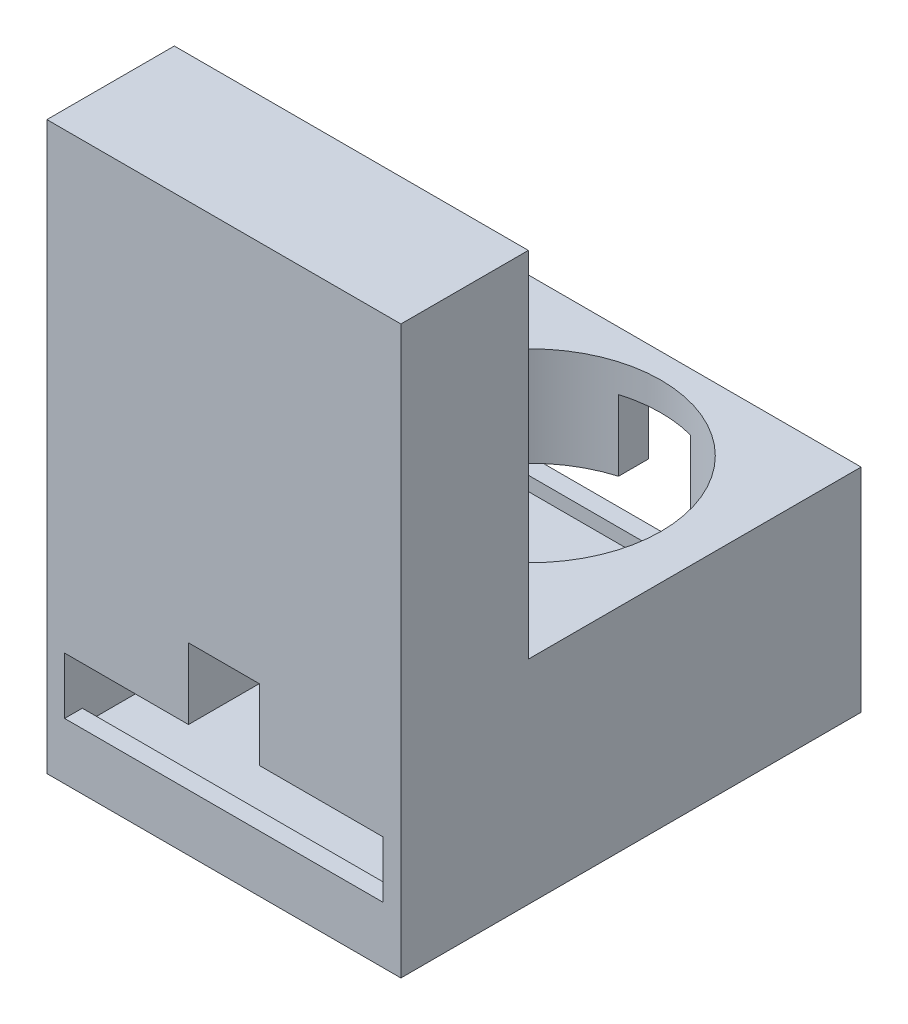
ISO-10303-21;
HEADER;
FILE_DESCRIPTION(('STEP AP214'),'2;1');
FILE_NAME('part.step','',(''),(''),'','','');
FILE_SCHEMA(('AUTOMOTIVE_DESIGN { 1 0 10303 214 1 1 1 1 }'));
ENDSEC;
DATA;
#1=APPLICATION_CONTEXT('core data for automotive mechanical design processes');
#2=APPLICATION_PROTOCOL_DEFINITION('international standard','automotive_design',2000,#1);
#3=PRODUCT_CONTEXT('',#1,'mechanical');
#4=PRODUCT('Part','Part','',(#3));
#5=PRODUCT_RELATED_PRODUCT_CATEGORY('part','',(#4));
#6=PRODUCT_DEFINITION_FORMATION('','',#4);
#7=PRODUCT_DEFINITION_CONTEXT('part definition',#1,'design');
#8=PRODUCT_DEFINITION('design','',#6,#7);
#9=PRODUCT_DEFINITION_SHAPE('','',#8);
#10=(LENGTH_UNIT() NAMED_UNIT(*) SI_UNIT(.MILLI.,.METRE.));
#11=(NAMED_UNIT(*) PLANE_ANGLE_UNIT() SI_UNIT($,.RADIAN.));
#12=(NAMED_UNIT(*) SI_UNIT($,.STERADIAN.) SOLID_ANGLE_UNIT());
#13=UNCERTAINTY_MEASURE_WITH_UNIT(LENGTH_MEASURE(1.E-05),#10,'distance_accuracy_value','');
#14=(GEOMETRIC_REPRESENTATION_CONTEXT(3) GLOBAL_UNCERTAINTY_ASSIGNED_CONTEXT((#13)) GLOBAL_UNIT_ASSIGNED_CONTEXT((#10,
#11,#12)) REPRESENTATION_CONTEXT('',''));
#15=CARTESIAN_POINT('',(0.,0.,0.));
#16=DIRECTION('',(0.,0.,1.));
#17=DIRECTION('',(1.,0.,0.));
#18=AXIS2_PLACEMENT_3D('',#15,#16,#17);
#19=CARTESIAN_POINT('',(0.,30.,0.));
#20=DIRECTION('',(0.,-1.,0.));
#21=DIRECTION('',(0.,0.,-1.));
#22=AXIS2_PLACEMENT_3D('',#19,#20,#21);
#23=PLANE('',#22);
#24=CARTESIAN_POINT('',(25.244510865418,30.,-43.));
#25=DIRECTION('',(0.,1.,0.));
#26=DIRECTION('',(0.,0.,1.));
#27=AXIS2_PLACEMENT_3D('',#24,#25,#26);
#28=CIRCLE('',#27,18.5);
#29=CARTESIAN_POINT('',(25.244510865418,30.,-24.5));
#30=VERTEX_POINT('',#29);
#31=EDGE_CURVE('E224',#30,#30,#28,.T.);
#32=ORIENTED_EDGE('',*,*,#31,.F.);
#33=EDGE_LOOP('',(#32));
#34=FACE_BOUND('',#33,.T.);
#35=DIRECTION('',(-1.,0.,0.));
#36=VECTOR('',#35,1.);
#37=CARTESIAN_POINT('',(0.,30.,-18.));
#38=LINE('',#37,#36);
#39=CARTESIAN_POINT('',(50.,30.,-18.));
#40=VERTEX_POINT('',#39);
#41=CARTESIAN_POINT('',(0.,30.,-18.));
#42=VERTEX_POINT('',#41);
#43=EDGE_CURVE('E59',#40,#42,#38,.T.);
#44=ORIENTED_EDGE('',*,*,#43,.F.);
#45=DIRECTION('',(0.,0.,-1.));
#46=VECTOR('',#45,1.);
#47=CARTESIAN_POINT('',(50.,30.,0.));
#48=LINE('',#47,#46);
#49=CARTESIAN_POINT('',(50.,30.,-65.));
#50=VERTEX_POINT('',#49);
#51=EDGE_CURVE('E340',#40,#50,#48,.T.);
#52=ORIENTED_EDGE('',*,*,#51,.T.);
#53=DIRECTION('',(-1.,0.,0.));
#54=VECTOR('',#53,1.);
#55=CARTESIAN_POINT('',(0.,30.,-65.));
#56=LINE('',#55,#54);
#57=CARTESIAN_POINT('',(0.,30.,-65.));
#58=VERTEX_POINT('',#57);
#59=EDGE_CURVE('E343',#50,#58,#56,.T.);
#60=ORIENTED_EDGE('',*,*,#59,.T.);
#61=DIRECTION('',(0.,0.,1.));
#62=VECTOR('',#61,1.);
#63=CARTESIAN_POINT('',(0.,30.,0.));
#64=LINE('',#63,#62);
#65=EDGE_CURVE('E338',#58,#42,#64,.T.);
#66=ORIENTED_EDGE('',*,*,#65,.T.);
#67=EDGE_LOOP('',(#44,#52,#60,#66));
#68=FACE_BOUND('',#67,.T.);
#69=ADVANCED_FACE('F44',(#34,#68),#23,.F.);
#70=CARTESIAN_POINT('',(20.,0.,-65.));
#71=DIRECTION('',(1.,0.,0.));
#72=DIRECTION('',(0.,0.,-1.));
#73=AXIS2_PLACEMENT_3D('',#70,#71,#72);
#74=PLANE('',#73);
#75=DIRECTION('',(0.,1.,0.));
#76=VECTOR('',#75,1.);
#77=CARTESIAN_POINT('',(20.,-36.3259018078045,-60.7410570649697));
#78=LINE('',#77,#76);
#79=CARTESIAN_POINT('',(20.,16.,-60.7410570649697));
#80=VERTEX_POINT('',#79);
#81=CARTESIAN_POINT('',(20.,26.,-60.7410570649697));
#82=VERTEX_POINT('',#81);
#83=EDGE_CURVE('E240',#80,#82,#78,.T.);
#84=ORIENTED_EDGE('',*,*,#83,.F.);
#85=DIRECTION('',(0.,0.,1.));
#86=VECTOR('',#85,1.);
#87=CARTESIAN_POINT('',(20.,16.,-65.));
#88=LINE('',#87,#86);
#89=CARTESIAN_POINT('',(20.,16.,-65.));
#90=VERTEX_POINT('',#89);
#91=EDGE_CURVE('E335',#90,#80,#88,.T.);
#92=ORIENTED_EDGE('',*,*,#91,.F.);
#93=DIRECTION('',(0.,1.,0.));
#94=VECTOR('',#93,1.);
#95=CARTESIAN_POINT('',(20.,0.,-65.));
#96=LINE('',#95,#94);
#97=CARTESIAN_POINT('',(20.,26.,-65.));
#98=VERTEX_POINT('',#97);
#99=EDGE_CURVE('E270',#90,#98,#96,.T.);
#100=ORIENTED_EDGE('',*,*,#99,.T.);
#101=DIRECTION('',(0.,0.,1.));
#102=VECTOR('',#101,1.);
#103=CARTESIAN_POINT('',(20.,26.,-65.));
#104=LINE('',#103,#102);
#105=EDGE_CURVE('E311',#98,#82,#104,.T.);
#106=ORIENTED_EDGE('',*,*,#105,.T.);
#107=EDGE_LOOP('',(#84,#92,#100,#106));
#108=FACE_BOUND('',#107,.T.);
#109=ADVANCED_FACE('F382',(#108),#74,.T.);
#110=CARTESIAN_POINT('',(0.,26.,-65.));
#111=DIRECTION('',(0.,-1.,0.));
#112=DIRECTION('',(1.,0.,0.));
#113=AXIS2_PLACEMENT_3D('',#110,#111,#112);
#114=PLANE('',#113);
#115=CARTESIAN_POINT('',(25.244510865418,26.,-43.));
#116=DIRECTION('',(0.,-1.,0.));
#117=DIRECTION('',(1.,0.,0.));
#118=AXIS2_PLACEMENT_3D('',#115,#116,#117);
#119=CIRCLE('',#118,18.5);
#120=CARTESIAN_POINT('',(30.,26.,-25.1216521151737));
#121=VERTEX_POINT('',#120);
#122=CARTESIAN_POINT('',(20.,26.,-25.2589429350303));
#123=VERTEX_POINT('',#122);
#124=EDGE_CURVE('E233',#121,#123,#119,.T.);
#125=ORIENTED_EDGE('',*,*,#124,.F.);
#126=DIRECTION('',(0.,0.,1.));
#127=VECTOR('',#126,1.);
#128=CARTESIAN_POINT('',(30.,26.,-65.));
#129=LINE('',#128,#127);
#130=CARTESIAN_POINT('',(30.,26.,0.));
#131=VERTEX_POINT('',#130);
#132=EDGE_CURVE('E318',#121,#131,#129,.T.);
#133=ORIENTED_EDGE('',*,*,#132,.T.);
#134=DIRECTION('',(1.,0.,0.));
#135=VECTOR('',#134,1.);
#136=CARTESIAN_POINT('',(0.,26.,0.));
#137=LINE('',#136,#135);
#138=CARTESIAN_POINT('',(20.,26.,0.));
#139=VERTEX_POINT('',#138);
#140=EDGE_CURVE('E273',#139,#131,#137,.T.);
#141=ORIENTED_EDGE('',*,*,#140,.F.);
#142=EDGE_CURVE('E314',#123,#139,#104,.T.);
#143=ORIENTED_EDGE('',*,*,#142,.F.);
#144=EDGE_LOOP('',(#125,#133,#141,#143));
#145=FACE_BOUND('',#144,.T.);
#146=ADVANCED_FACE('F388',(#145),#114,.T.);
#147=CARTESIAN_POINT('',(30.,0.,-65.));
#148=DIRECTION('',(1.,0.,0.));
#149=DIRECTION('',(0.,1.,0.));
#150=AXIS2_PLACEMENT_3D('',#147,#148,#149);
#151=PLANE('',#150);
#152=DIRECTION('',(0.,0.,1.));
#153=VECTOR('',#152,1.);
#154=CARTESIAN_POINT('',(30.,16.,-65.));
#155=LINE('',#154,#153);
#156=CARTESIAN_POINT('',(30.,16.,-65.));
#157=VERTEX_POINT('',#156);
#158=CARTESIAN_POINT('',(30.,16.,-60.8783478848263));
#159=VERTEX_POINT('',#158);
#160=EDGE_CURVE('E319',#157,#159,#155,.T.);
#161=ORIENTED_EDGE('',*,*,#160,.T.);
#162=DIRECTION('',(0.,1.,0.));
#163=VECTOR('',#162,1.);
#164=CARTESIAN_POINT('',(30.,-36.3259018078045,-60.8783478848263));
#165=LINE('',#164,#163);
#166=CARTESIAN_POINT('',(30.,26.,-60.8783478848263));
#167=VERTEX_POINT('',#166);
#168=EDGE_CURVE('E237',#159,#167,#165,.T.);
#169=ORIENTED_EDGE('',*,*,#168,.T.);
#170=CARTESIAN_POINT('',(30.,26.,-65.));
#171=VERTEX_POINT('',#170);
#172=EDGE_CURVE('E315',#171,#167,#129,.T.);
#173=ORIENTED_EDGE('',*,*,#172,.F.);
#174=DIRECTION('',(0.,1.,0.));
#175=VECTOR('',#174,1.);
#176=CARTESIAN_POINT('',(30.,0.,-65.));
#177=LINE('',#176,#175);
#178=EDGE_CURVE('E285',#157,#171,#177,.T.);
#179=ORIENTED_EDGE('',*,*,#178,.F.);
#180=EDGE_LOOP('',(#161,#169,#173,#179));
#181=FACE_BOUND('',#180,.T.);
#182=ADVANCED_FACE('F411',(#181),#151,.F.);
#183=CARTESIAN_POINT('',(0.,8.,-65.));
#184=DIRECTION('',(0.,-1.,0.));
#185=DIRECTION('',(0.,0.,-1.));
#186=AXIS2_PLACEMENT_3D('',#183,#184,#185);
#187=PLANE('',#186);
#188=DIRECTION('',(1.,0.,0.));
#189=VECTOR('',#188,1.);
#190=CARTESIAN_POINT('',(-57.5333240792145,8.,-2.5));
#191=LINE('',#190,#189);
#192=CARTESIAN_POINT('',(2.5,8.,-2.5));
#193=VERTEX_POINT('',#192);
#194=CARTESIAN_POINT('',(47.5,8.,-2.5));
#195=VERTEX_POINT('',#194);
#196=EDGE_CURVE('E265',#193,#195,#191,.T.);
#197=ORIENTED_EDGE('',*,*,#196,.F.);
#198=DIRECTION('',(0.,0.,1.));
#199=VECTOR('',#198,1.);
#200=CARTESIAN_POINT('',(2.5,8.,-65.));
#201=LINE('',#200,#199);
#202=CARTESIAN_POINT('',(2.5,8.,0.));
#203=VERTEX_POINT('',#202);
#204=EDGE_CURVE('E332',#193,#203,#201,.T.);
#205=ORIENTED_EDGE('',*,*,#204,.T.);
#206=DIRECTION('',(1.,0.,0.));
#207=VECTOR('',#206,1.);
#208=CARTESIAN_POINT('',(0.,8.,0.));
#209=LINE('',#208,#207);
#210=CARTESIAN_POINT('',(47.5,8.,0.));
#211=VERTEX_POINT('',#210);
#212=EDGE_CURVE('E300',#203,#211,#209,.T.);
#213=ORIENTED_EDGE('',*,*,#212,.T.);
#214=DIRECTION('',(0.,0.,1.));
#215=VECTOR('',#214,1.);
#216=CARTESIAN_POINT('',(47.5,8.,-65.));
#217=LINE('',#216,#215);
#218=EDGE_CURVE('E328',#195,#211,#217,.T.);
#219=ORIENTED_EDGE('',*,*,#218,.F.);
#220=EDGE_LOOP('',(#197,#205,#213,#219));
#221=FACE_BOUND('',#220,.T.);
#222=ADVANCED_FACE('F405',(#221),#187,.F.);
#223=DIRECTION('',(1.,0.,0.));
#224=VECTOR('',#223,1.);
#225=CARTESIAN_POINT('',(-57.5333240792145,7.99999999999999,-62.5));
#226=LINE('',#225,#224);
#227=CARTESIAN_POINT('',(2.5,8.,-62.5));
#228=VERTEX_POINT('',#227);
#229=CARTESIAN_POINT('',(47.5,7.99999999999999,-62.5));
#230=VERTEX_POINT('',#229);
#231=EDGE_CURVE('E262',#228,#230,#226,.T.);
#232=ORIENTED_EDGE('',*,*,#231,.T.);
#233=CARTESIAN_POINT('',(47.5,8.,-65.));
#234=VERTEX_POINT('',#233);
#235=EDGE_CURVE('E325',#234,#230,#217,.T.);
#236=ORIENTED_EDGE('',*,*,#235,.F.);
#237=DIRECTION('',(1.,0.,0.));
#238=VECTOR('',#237,1.);
#239=CARTESIAN_POINT('',(0.,8.,-65.));
#240=LINE('',#239,#238);
#241=CARTESIAN_POINT('',(2.5,8.,-65.));
#242=VERTEX_POINT('',#241);
#243=EDGE_CURVE('E279',#242,#234,#240,.T.);
#244=ORIENTED_EDGE('',*,*,#243,.F.);
#245=EDGE_CURVE('E329',#242,#228,#201,.T.);
#246=ORIENTED_EDGE('',*,*,#245,.T.);
#247=EDGE_LOOP('',(#232,#236,#244,#246));
#248=FACE_BOUND('',#247,.T.);
#249=ADVANCED_FACE('F401',(#248),#187,.F.);
#250=CARTESIAN_POINT('',(0.,30.,0.));
#251=DIRECTION('',(0.,0.,-1.));
#252=DIRECTION('',(-1.,0.,0.));
#253=AXIS2_PLACEMENT_3D('',#250,#251,#252);
#254=PLANE('',#253);
#255=DIRECTION('',(1.,0.,0.));
#256=VECTOR('',#255,1.);
#257=CARTESIAN_POINT('',(0.,0.,0.));
#258=LINE('',#257,#256);
#259=CARTESIAN_POINT('',(0.,0.,0.));
#260=VERTEX_POINT('',#259);
#261=CARTESIAN_POINT('',(50.,0.,0.));
#262=VERTEX_POINT('',#261);
#263=EDGE_CURVE('E347',#260,#262,#258,.T.);
#264=ORIENTED_EDGE('',*,*,#263,.T.);
#265=DIRECTION('',(0.,-1.,0.));
#266=VECTOR('',#265,1.);
#267=CARTESIAN_POINT('',(50.,30.,0.));
#268=LINE('',#267,#266);
#269=CARTESIAN_POINT('',(50.,80.,0.));
#270=VERTEX_POINT('',#269);
#271=EDGE_CURVE('E52',#270,#262,#268,.T.);
#272=ORIENTED_EDGE('',*,*,#271,.F.);
#273=DIRECTION('',(1.,0.,0.));
#274=VECTOR('',#273,1.);
#275=CARTESIAN_POINT('',(0.,80.,0.));
#276=LINE('',#275,#274);
#277=CARTESIAN_POINT('',(0.,80.,0.));
#278=VERTEX_POINT('',#277);
#279=EDGE_CURVE('E202',#278,#270,#276,.T.);
#280=ORIENTED_EDGE('',*,*,#279,.F.);
#281=DIRECTION('',(0.,-1.,0.));
#282=VECTOR('',#281,1.);
#283=CARTESIAN_POINT('',(0.,30.,0.));
#284=LINE('',#283,#282);
#285=EDGE_CURVE('E11',#278,#260,#284,.T.);
#286=ORIENTED_EDGE('',*,*,#285,.T.);
#287=EDGE_LOOP('',(#264,#272,#280,#286));
#288=FACE_BOUND('',#287,.T.);
#289=DIRECTION('',(0.,1.,0.));
#290=VECTOR('',#289,1.);
#291=CARTESIAN_POINT('',(20.,0.,0.));
#292=LINE('',#291,#290);
#293=CARTESIAN_POINT('',(20.,16.,0.));
#294=VERTEX_POINT('',#293);
#295=EDGE_CURVE('E253',#294,#139,#292,.T.);
#296=ORIENTED_EDGE('',*,*,#295,.T.);
#297=ORIENTED_EDGE('',*,*,#140,.T.);
#298=DIRECTION('',(0.,1.,0.));
#299=VECTOR('',#298,1.);
#300=CARTESIAN_POINT('',(30.,0.,0.));
#301=LINE('',#300,#299);
#302=CARTESIAN_POINT('',(30.,16.,0.));
#303=VERTEX_POINT('',#302);
#304=EDGE_CURVE('E306',#303,#131,#301,.T.);
#305=ORIENTED_EDGE('',*,*,#304,.F.);
#306=DIRECTION('',(1.,0.,0.));
#307=VECTOR('',#306,1.);
#308=CARTESIAN_POINT('',(0.,16.,0.));
#309=LINE('',#308,#307);
#310=CARTESIAN_POINT('',(47.5,16.,0.));
#311=VERTEX_POINT('',#310);
#312=EDGE_CURVE('E297',#303,#311,#309,.T.);
#313=ORIENTED_EDGE('',*,*,#312,.T.);
#314=DIRECTION('',(0.,1.,0.));
#315=VECTOR('',#314,1.);
#316=CARTESIAN_POINT('',(47.5,0.,0.));
#317=LINE('',#316,#315);
#318=EDGE_CURVE('E303',#211,#311,#317,.T.);
#319=ORIENTED_EDGE('',*,*,#318,.F.);
#320=ORIENTED_EDGE('',*,*,#212,.F.);
#321=DIRECTION('',(0.,1.,0.));
#322=VECTOR('',#321,1.);
#323=CARTESIAN_POINT('',(2.5,0.,0.));
#324=LINE('',#323,#322);
#325=CARTESIAN_POINT('',(2.5,16.,0.));
#326=VERTEX_POINT('',#325);
#327=EDGE_CURVE('E296',#203,#326,#324,.T.);
#328=ORIENTED_EDGE('',*,*,#327,.T.);
#329=EDGE_CURVE('E293',#326,#294,#309,.T.);
#330=ORIENTED_EDGE('',*,*,#329,.T.);
#331=EDGE_LOOP('',(#296,#297,#305,#313,#319,#320,#328,#330));
#332=FACE_BOUND('',#331,.T.);
#333=ADVANCED_FACE('F203',(#288,#332),#254,.F.);
#334=CARTESIAN_POINT('',(0.,30.,-65.));
#335=DIRECTION('',(0.,0.,1.));
#336=DIRECTION('',(1.,0.,0.));
#337=AXIS2_PLACEMENT_3D('',#334,#335,#336);
#338=PLANE('',#337);
#339=DIRECTION('',(-1.,0.,0.));
#340=VECTOR('',#339,1.);
#341=CARTESIAN_POINT('',(0.,0.,-65.));
#342=LINE('',#341,#340);
#343=CARTESIAN_POINT('',(50.,0.,-65.));
#344=VERTEX_POINT('',#343);
#345=CARTESIAN_POINT('',(0.,0.,-65.));
#346=VERTEX_POINT('',#345);
#347=EDGE_CURVE('E341',#344,#346,#342,.T.);
#348=ORIENTED_EDGE('',*,*,#347,.T.);
#349=DIRECTION('',(0.,-1.,0.));
#350=VECTOR('',#349,1.);
#351=CARTESIAN_POINT('',(0.,30.,-65.));
#352=LINE('',#351,#350);
#353=EDGE_CURVE('E345',#58,#346,#352,.T.);
#354=ORIENTED_EDGE('',*,*,#353,.F.);
#355=ORIENTED_EDGE('',*,*,#59,.F.);
#356=DIRECTION('',(0.,-1.,0.));
#357=VECTOR('',#356,1.);
#358=CARTESIAN_POINT('',(50.,30.,-65.));
#359=LINE('',#358,#357);
#360=EDGE_CURVE('E353',#50,#344,#359,.T.);
#361=ORIENTED_EDGE('',*,*,#360,.T.);
#362=EDGE_LOOP('',(#348,#354,#355,#361));
#363=FACE_BOUND('',#362,.T.);
#364=ORIENTED_EDGE('',*,*,#99,.F.);
#365=DIRECTION('',(1.,0.,0.));
#366=VECTOR('',#365,1.);
#367=CARTESIAN_POINT('',(0.,16.,-65.));
#368=LINE('',#367,#366);
#369=CARTESIAN_POINT('',(2.5,16.,-65.));
#370=VERTEX_POINT('',#369);
#371=EDGE_CURVE('E272',#370,#90,#368,.T.);
#372=ORIENTED_EDGE('',*,*,#371,.F.);
#373=DIRECTION('',(0.,1.,0.));
#374=VECTOR('',#373,1.);
#375=CARTESIAN_POINT('',(2.5,0.,-65.));
#376=LINE('',#375,#374);
#377=EDGE_CURVE('E275',#242,#370,#376,.T.);
#378=ORIENTED_EDGE('',*,*,#377,.F.);
#379=ORIENTED_EDGE('',*,*,#243,.T.);
#380=DIRECTION('',(0.,1.,0.));
#381=VECTOR('',#380,1.);
#382=CARTESIAN_POINT('',(47.5,0.,-65.));
#383=LINE('',#382,#381);
#384=CARTESIAN_POINT('',(47.5,16.,-65.));
#385=VERTEX_POINT('',#384);
#386=EDGE_CURVE('E282',#234,#385,#383,.T.);
#387=ORIENTED_EDGE('',*,*,#386,.T.);
#388=EDGE_CURVE('E276',#157,#385,#368,.T.);
#389=ORIENTED_EDGE('',*,*,#388,.F.);
#390=ORIENTED_EDGE('',*,*,#178,.T.);
#391=DIRECTION('',(1.,0.,0.));
#392=VECTOR('',#391,1.);
#393=CARTESIAN_POINT('',(0.,26.,-65.));
#394=LINE('',#393,#392);
#395=EDGE_CURVE('E288',#98,#171,#394,.T.);
#396=ORIENTED_EDGE('',*,*,#395,.F.);
#397=EDGE_LOOP('',(#364,#372,#378,#379,#387,#389,#390,#396));
#398=FACE_BOUND('',#397,.T.);
#399=ADVANCED_FACE('F365',(#363,#398),#338,.F.);
#400=CARTESIAN_POINT('',(0.,30.,0.));
#401=DIRECTION('',(1.,0.,0.));
#402=DIRECTION('',(0.,0.,-1.));
#403=AXIS2_PLACEMENT_3D('',#400,#401,#402);
#404=PLANE('',#403);
#405=DIRECTION('',(0.,0.,1.));
#406=VECTOR('',#405,1.);
#407=CARTESIAN_POINT('',(0.,0.,0.));
#408=LINE('',#407,#406);
#409=EDGE_CURVE('E199',#346,#260,#408,.T.);
#410=ORIENTED_EDGE('',*,*,#409,.T.);
#411=ORIENTED_EDGE('',*,*,#285,.F.);
#412=DIRECTION('',(0.,0.,1.));
#413=VECTOR('',#412,1.);
#414=CARTESIAN_POINT('',(0.,80.,0.));
#415=LINE('',#414,#413);
#416=CARTESIAN_POINT('',(0.,80.,-18.));
#417=VERTEX_POINT('',#416);
#418=EDGE_CURVE('E196',#417,#278,#415,.T.);
#419=ORIENTED_EDGE('',*,*,#418,.F.);
#420=DIRECTION('',(0.,-1.,0.));
#421=VECTOR('',#420,1.);
#422=CARTESIAN_POINT('',(0.,80.,-18.));
#423=LINE('',#422,#421);
#424=EDGE_CURVE('E218',#417,#42,#423,.T.);
#425=ORIENTED_EDGE('',*,*,#424,.T.);
#426=ORIENTED_EDGE('',*,*,#65,.F.);
#427=ORIENTED_EDGE('',*,*,#353,.T.);
#428=EDGE_LOOP('',(#410,#411,#419,#425,#426,#427));
#429=FACE_BOUND('',#428,.T.);
#430=ADVANCED_FACE('F46',(#429),#404,.F.);
#431=CARTESIAN_POINT('',(50.,30.,0.));
#432=DIRECTION('',(-1.,0.,0.));
#433=DIRECTION('',(0.,0.,1.));
#434=AXIS2_PLACEMENT_3D('',#431,#432,#433);
#435=PLANE('',#434);
#436=DIRECTION('',(0.,0.,-1.));
#437=VECTOR('',#436,1.);
#438=CARTESIAN_POINT('',(50.,0.,0.));
#439=LINE('',#438,#437);
#440=EDGE_CURVE('E349',#262,#344,#439,.T.);
#441=ORIENTED_EDGE('',*,*,#440,.T.);
#442=ORIENTED_EDGE('',*,*,#360,.F.);
#443=ORIENTED_EDGE('',*,*,#51,.F.);
#444=DIRECTION('',(0.,-1.,0.));
#445=VECTOR('',#444,1.);
#446=CARTESIAN_POINT('',(50.,80.,-18.));
#447=LINE('',#446,#445);
#448=CARTESIAN_POINT('',(50.,80.,-18.));
#449=VERTEX_POINT('',#448);
#450=EDGE_CURVE('E221',#449,#40,#447,.T.);
#451=ORIENTED_EDGE('',*,*,#450,.F.);
#452=DIRECTION('',(0.,0.,-1.));
#453=VECTOR('',#452,1.);
#454=CARTESIAN_POINT('',(50.,80.,0.));
#455=LINE('',#454,#453);
#456=EDGE_CURVE('E208',#270,#449,#455,.T.);
#457=ORIENTED_EDGE('',*,*,#456,.F.);
#458=ORIENTED_EDGE('',*,*,#271,.T.);
#459=EDGE_LOOP('',(#441,#442,#443,#451,#457,#458));
#460=FACE_BOUND('',#459,.T.);
#461=ADVANCED_FACE('F357',(#460),#435,.F.);
#462=CARTESIAN_POINT('',(0.,0.,0.));
#463=DIRECTION('',(0.,-1.,0.));
#464=DIRECTION('',(0.,0.,-1.));
#465=AXIS2_PLACEMENT_3D('',#462,#463,#464);
#466=PLANE('',#465);
#467=ORIENTED_EDGE('',*,*,#409,.F.);
#468=ORIENTED_EDGE('',*,*,#347,.F.);
#469=ORIENTED_EDGE('',*,*,#440,.F.);
#470=ORIENTED_EDGE('',*,*,#263,.F.);
#471=EDGE_LOOP('',(#467,#468,#469,#470));
#472=FACE_BOUND('',#471,.T.);
#473=ADVANCED_FACE('F362',(#472),#466,.T.);
#474=DIRECTION('',(0.,1.,0.));
#475=VECTOR('',#474,1.);
#476=CARTESIAN_POINT('',(20.,-36.3259018078045,-25.2589429350303));
#477=LINE('',#476,#475);
#478=CARTESIAN_POINT('',(20.,16.,-25.2589429350303));
#479=VERTEX_POINT('',#478);
#480=EDGE_CURVE('E67',#123,#479,#477,.F.);
#481=ORIENTED_EDGE('',*,*,#480,.F.);
#482=ORIENTED_EDGE('',*,*,#142,.T.);
#483=ORIENTED_EDGE('',*,*,#295,.F.);
#484=EDGE_CURVE('E290',#479,#294,#88,.T.);
#485=ORIENTED_EDGE('',*,*,#484,.F.);
#486=EDGE_LOOP('',(#481,#482,#483,#485));
#487=FACE_BOUND('',#486,.T.);
#488=ADVANCED_FACE('F391',(#487),#74,.T.);
#489=EDGE_CURVE('E235',#82,#167,#119,.T.);
#490=ORIENTED_EDGE('',*,*,#489,.F.);
#491=ORIENTED_EDGE('',*,*,#105,.F.);
#492=ORIENTED_EDGE('',*,*,#395,.T.);
#493=ORIENTED_EDGE('',*,*,#172,.T.);
#494=EDGE_LOOP('',(#490,#491,#492,#493));
#495=FACE_BOUND('',#494,.T.);
#496=ADVANCED_FACE('F456',(#495),#114,.T.);
#497=ORIENTED_EDGE('',*,*,#132,.F.);
#498=DIRECTION('',(0.,1.,0.));
#499=VECTOR('',#498,1.);
#500=CARTESIAN_POINT('',(30.,-36.3259018078045,-25.1216521151737));
#501=LINE('',#500,#499);
#502=CARTESIAN_POINT('',(30.,16.,-25.1216521151737));
#503=VERTEX_POINT('',#502);
#504=EDGE_CURVE('E230',#121,#503,#501,.F.);
#505=ORIENTED_EDGE('',*,*,#504,.T.);
#506=EDGE_CURVE('E322',#503,#303,#155,.T.);
#507=ORIENTED_EDGE('',*,*,#506,.T.);
#508=ORIENTED_EDGE('',*,*,#304,.T.);
#509=EDGE_LOOP('',(#497,#505,#507,#508));
#510=FACE_BOUND('',#509,.T.);
#511=ADVANCED_FACE('F469',(#510),#151,.F.);
#512=CARTESIAN_POINT('',(0.,16.,-65.));
#513=DIRECTION('',(0.,-1.,0.));
#514=DIRECTION('',(0.,0.,-1.));
#515=AXIS2_PLACEMENT_3D('',#512,#513,#514);
#516=PLANE('',#515);
#517=CARTESIAN_POINT('',(25.244510865418,16.,-43.));
#518=DIRECTION('',(0.,-1.,0.));
#519=DIRECTION('',(0.,0.,-1.));
#520=AXIS2_PLACEMENT_3D('',#517,#518,#519);
#521=CIRCLE('',#520,18.5);
#522=EDGE_CURVE('E227',#503,#159,#521,.F.);
#523=ORIENTED_EDGE('',*,*,#522,.T.);
#524=ORIENTED_EDGE('',*,*,#160,.F.);
#525=ORIENTED_EDGE('',*,*,#388,.T.);
#526=DIRECTION('',(0.,0.,1.));
#527=VECTOR('',#526,1.);
#528=CARTESIAN_POINT('',(47.5,16.,-65.));
#529=LINE('',#528,#527);
#530=EDGE_CURVE('E323',#385,#311,#529,.T.);
#531=ORIENTED_EDGE('',*,*,#530,.T.);
#532=ORIENTED_EDGE('',*,*,#312,.F.);
#533=ORIENTED_EDGE('',*,*,#506,.F.);
#534=EDGE_LOOP('',(#523,#524,#525,#531,#532,#533));
#535=FACE_BOUND('',#534,.T.);
#536=ADVANCED_FACE('F426',(#535),#516,.T.);
#537=CARTESIAN_POINT('',(47.5,0.,-65.));
#538=DIRECTION('',(1.,0.,0.));
#539=DIRECTION('',(0.,0.,-1.));
#540=AXIS2_PLACEMENT_3D('',#537,#538,#539);
#541=PLANE('',#540);
#542=ORIENTED_EDGE('',*,*,#318,.T.);
#543=ORIENTED_EDGE('',*,*,#530,.F.);
#544=ORIENTED_EDGE('',*,*,#386,.F.);
#545=ORIENTED_EDGE('',*,*,#235,.T.);
#546=DIRECTION('',(0.,-1.,0.));
#547=VECTOR('',#546,1.);
#548=CARTESIAN_POINT('',(47.5,7.99999999999999,-62.5));
#549=LINE('',#548,#547);
#550=CARTESIAN_POINT('',(47.5,5.99999999999999,-62.5));
#551=VERTEX_POINT('',#550);
#552=EDGE_CURVE('E242',#230,#551,#549,.T.);
#553=ORIENTED_EDGE('',*,*,#552,.T.);
#554=DIRECTION('',(0.,0.,1.));
#555=VECTOR('',#554,1.);
#556=CARTESIAN_POINT('',(47.5,5.99999999999999,-62.5));
#557=LINE('',#556,#555);
#558=CARTESIAN_POINT('',(47.5,6.,-2.5));
#559=VERTEX_POINT('',#558);
#560=EDGE_CURVE('E256',#551,#559,#557,.T.);
#561=ORIENTED_EDGE('',*,*,#560,.T.);
#562=DIRECTION('',(0.,1.,0.));
#563=VECTOR('',#562,1.);
#564=CARTESIAN_POINT('',(47.5,8.,-2.5));
#565=LINE('',#564,#563);
#566=EDGE_CURVE('E259',#559,#195,#565,.T.);
#567=ORIENTED_EDGE('',*,*,#566,.T.);
#568=ORIENTED_EDGE('',*,*,#218,.T.);
#569=EDGE_LOOP('',(#542,#543,#544,#545,#553,#561,#567,#568));
#570=FACE_BOUND('',#569,.T.);
#571=ADVANCED_FACE('F414',(#570),#541,.F.);
#572=CARTESIAN_POINT('',(2.5,0.,-65.));
#573=DIRECTION('',(1.,0.,0.));
#574=DIRECTION('',(0.,0.,-1.));
#575=AXIS2_PLACEMENT_3D('',#572,#573,#574);
#576=PLANE('',#575);
#577=ORIENTED_EDGE('',*,*,#327,.F.);
#578=ORIENTED_EDGE('',*,*,#204,.F.);
#579=DIRECTION('',(0.,-1.,0.));
#580=VECTOR('',#579,1.);
#581=CARTESIAN_POINT('',(2.5,8.,-2.5));
#582=LINE('',#581,#580);
#583=CARTESIAN_POINT('',(2.5,6.,-2.5));
#584=VERTEX_POINT('',#583);
#585=EDGE_CURVE('E243',#193,#584,#582,.T.);
#586=ORIENTED_EDGE('',*,*,#585,.T.);
#587=DIRECTION('',(0.,0.,-1.));
#588=VECTOR('',#587,1.);
#589=CARTESIAN_POINT('',(2.5,5.99999999999999,-62.5));
#590=LINE('',#589,#588);
#591=CARTESIAN_POINT('',(2.5,5.99999999999999,-62.5));
#592=VERTEX_POINT('',#591);
#593=EDGE_CURVE('E246',#584,#592,#590,.T.);
#594=ORIENTED_EDGE('',*,*,#593,.T.);
#595=DIRECTION('',(0.,1.,0.));
#596=VECTOR('',#595,1.);
#597=CARTESIAN_POINT('',(2.5,7.99999999999999,-62.5));
#598=LINE('',#597,#596);
#599=EDGE_CURVE('E250',#592,#228,#598,.T.);
#600=ORIENTED_EDGE('',*,*,#599,.T.);
#601=ORIENTED_EDGE('',*,*,#245,.F.);
#602=ORIENTED_EDGE('',*,*,#377,.T.);
#603=DIRECTION('',(0.,0.,1.));
#604=VECTOR('',#603,1.);
#605=CARTESIAN_POINT('',(2.5,16.,-65.));
#606=LINE('',#605,#604);
#607=EDGE_CURVE('E333',#370,#326,#606,.T.);
#608=ORIENTED_EDGE('',*,*,#607,.T.);
#609=EDGE_LOOP('',(#577,#578,#586,#594,#600,#601,#602,#608));
#610=FACE_BOUND('',#609,.T.);
#611=ADVANCED_FACE('F416',(#610),#576,.T.);
#612=EDGE_CURVE('E228',#80,#479,#521,.F.);
#613=ORIENTED_EDGE('',*,*,#612,.T.);
#614=ORIENTED_EDGE('',*,*,#484,.T.);
#615=ORIENTED_EDGE('',*,*,#329,.F.);
#616=ORIENTED_EDGE('',*,*,#607,.F.);
#617=ORIENTED_EDGE('',*,*,#371,.T.);
#618=ORIENTED_EDGE('',*,*,#91,.T.);
#619=EDGE_LOOP('',(#613,#614,#615,#616,#617,#618));
#620=FACE_BOUND('',#619,.T.);
#621=ADVANCED_FACE('F418',(#620),#516,.T.);
#622=CARTESIAN_POINT('',(-57.5333240792145,8.,-2.5));
#623=DIRECTION('',(0.,0.,-1.));
#624=DIRECTION('',(0.,1.,0.));
#625=AXIS2_PLACEMENT_3D('',#622,#623,#624);
#626=PLANE('',#625);
#627=ORIENTED_EDGE('',*,*,#196,.T.);
#628=ORIENTED_EDGE('',*,*,#566,.F.);
#629=DIRECTION('',(1.,0.,0.));
#630=VECTOR('',#629,1.);
#631=CARTESIAN_POINT('',(-57.5333240792145,6.,-2.5));
#632=LINE('',#631,#630);
#633=EDGE_CURVE('E267',#584,#559,#632,.T.);
#634=ORIENTED_EDGE('',*,*,#633,.F.);
#635=ORIENTED_EDGE('',*,*,#585,.F.);
#636=EDGE_LOOP('',(#627,#628,#634,#635));
#637=FACE_BOUND('',#636,.T.);
#638=ADVANCED_FACE('F424',(#637),#626,.T.);
#639=CARTESIAN_POINT('',(-57.5333240792145,5.99999999999999,-62.5));
#640=DIRECTION('',(0.,1.,0.));
#641=DIRECTION('',(0.,0.,1.));
#642=AXIS2_PLACEMENT_3D('',#639,#640,#641);
#643=PLANE('',#642);
#644=ORIENTED_EDGE('',*,*,#633,.T.);
#645=ORIENTED_EDGE('',*,*,#560,.F.);
#646=DIRECTION('',(1.,0.,0.));
#647=VECTOR('',#646,1.);
#648=CARTESIAN_POINT('',(-57.5333240792145,5.99999999999999,-62.5));
#649=LINE('',#648,#647);
#650=EDGE_CURVE('E247',#592,#551,#649,.T.);
#651=ORIENTED_EDGE('',*,*,#650,.F.);
#652=ORIENTED_EDGE('',*,*,#593,.F.);
#653=EDGE_LOOP('',(#644,#645,#651,#652));
#654=FACE_BOUND('',#653,.T.);
#655=ADVANCED_FACE('F442',(#654),#643,.T.);
#656=CARTESIAN_POINT('',(-57.5333240792145,7.99999999999999,-62.5));
#657=DIRECTION('',(0.,0.,1.));
#658=DIRECTION('',(1.,0.,0.));
#659=AXIS2_PLACEMENT_3D('',#656,#657,#658);
#660=PLANE('',#659);
#661=ORIENTED_EDGE('',*,*,#650,.T.);
#662=ORIENTED_EDGE('',*,*,#552,.F.);
#663=ORIENTED_EDGE('',*,*,#231,.F.);
#664=ORIENTED_EDGE('',*,*,#599,.F.);
#665=EDGE_LOOP('',(#661,#662,#663,#664));
#666=FACE_BOUND('',#665,.T.);
#667=ADVANCED_FACE('F379',(#666),#660,.T.);
#668=CARTESIAN_POINT('',(25.244510865418,-36.3259018078045,-43.));
#669=DIRECTION('',(0.,1.,0.));
#670=DIRECTION('',(0.,0.,1.));
#671=AXIS2_PLACEMENT_3D('',#668,#669,#670);
#672=CYLINDRICAL_SURFACE('',#671,18.5);
#673=ORIENTED_EDGE('',*,*,#83,.T.);
#674=ORIENTED_EDGE('',*,*,#489,.T.);
#675=ORIENTED_EDGE('',*,*,#168,.F.);
#676=ORIENTED_EDGE('',*,*,#522,.F.);
#677=ORIENTED_EDGE('',*,*,#504,.F.);
#678=ORIENTED_EDGE('',*,*,#124,.T.);
#679=ORIENTED_EDGE('',*,*,#480,.T.);
#680=ORIENTED_EDGE('',*,*,#612,.F.);
#681=EDGE_LOOP('',(#673,#674,#675,#676,#677,#678,#679,#680));
#682=FACE_BOUND('',#681,.T.);
#683=ORIENTED_EDGE('',*,*,#31,.T.);
#684=EDGE_LOOP('',(#683));
#685=FACE_BOUND('',#684,.T.);
#686=ADVANCED_FACE('F372',(#682,#685),#672,.F.);
#687=CARTESIAN_POINT('',(0.,80.,-18.));
#688=DIRECTION('',(0.,0.,1.));
#689=DIRECTION('',(1.,0.,0.));
#690=AXIS2_PLACEMENT_3D('',#687,#688,#689);
#691=PLANE('',#690);
#692=ORIENTED_EDGE('',*,*,#43,.T.);
#693=ORIENTED_EDGE('',*,*,#424,.F.);
#694=DIRECTION('',(-1.,0.,0.));
#695=VECTOR('',#694,1.);
#696=CARTESIAN_POINT('',(0.,80.,-18.));
#697=LINE('',#696,#695);
#698=EDGE_CURVE('E212',#449,#417,#697,.T.);
#699=ORIENTED_EDGE('',*,*,#698,.F.);
#700=ORIENTED_EDGE('',*,*,#450,.T.);
#701=EDGE_LOOP('',(#692,#693,#699,#700));
#702=FACE_BOUND('',#701,.T.);
#703=ADVANCED_FACE('F370',(#702),#691,.F.);
#704=CARTESIAN_POINT('',(0.,80.,0.));
#705=DIRECTION('',(0.,-1.,0.));
#706=DIRECTION('',(0.,0.,-1.));
#707=AXIS2_PLACEMENT_3D('',#704,#705,#706);
#708=PLANE('',#707);
#709=ORIENTED_EDGE('',*,*,#418,.T.);
#710=ORIENTED_EDGE('',*,*,#279,.T.);
#711=ORIENTED_EDGE('',*,*,#456,.T.);
#712=ORIENTED_EDGE('',*,*,#698,.T.);
#713=EDGE_LOOP('',(#709,#710,#711,#712));
#714=FACE_BOUND('',#713,.T.);
#715=ADVANCED_FACE('F210',(#714),#708,.F.);
#716=CLOSED_SHELL('',(#69,#109,#146,#182,#222,#249,#333,#399,#430,#461,#473,#488,#496,#511,#536,
#571,#611,#621,#638,#655,#667,#686,#703,#715));
#717=MANIFOLD_SOLID_BREP('B2',#716);
#718=ADVANCED_BREP_SHAPE_REPRESENTATION('',(#18,#717),#14);
#719=SHAPE_DEFINITION_REPRESENTATION(#9,#718);
ENDSEC;
END-ISO-10303-21;
